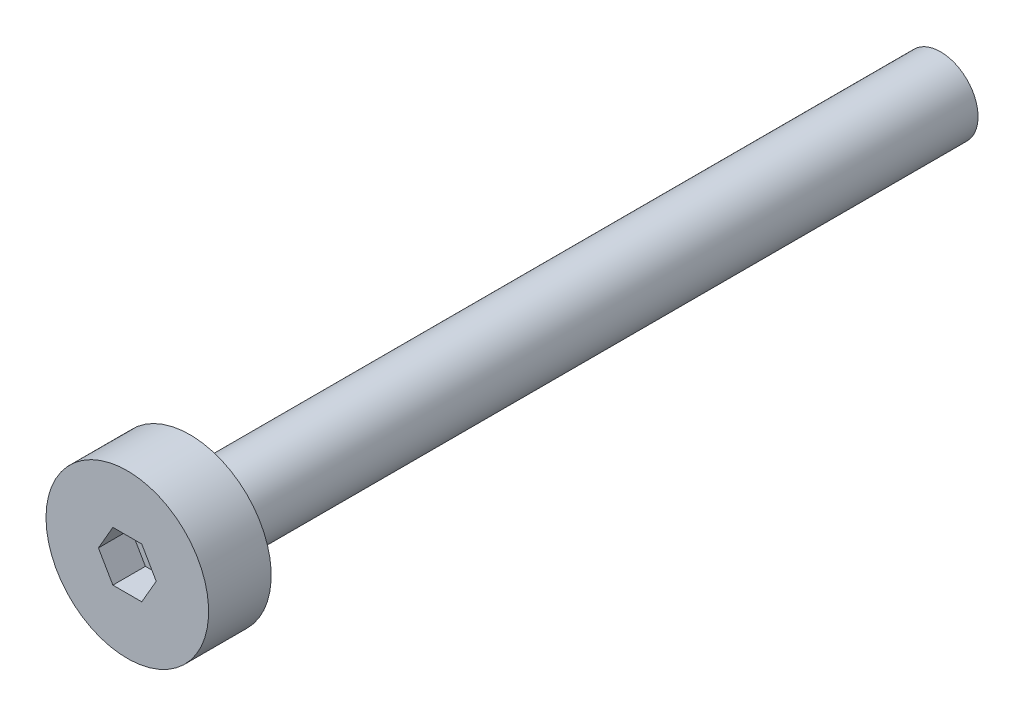
ISO-10303-21;
HEADER;
FILE_DESCRIPTION(('STEP AP214'),'2;1');
FILE_NAME('part.step','',(''),(''),'','','');
FILE_SCHEMA(('AUTOMOTIVE_DESIGN { 1 0 10303 214 1 1 1 1 }'));
ENDSEC;
DATA;
#1=APPLICATION_CONTEXT('core data for automotive mechanical design processes');
#2=APPLICATION_PROTOCOL_DEFINITION('international standard','automotive_design',2000,#1);
#3=PRODUCT_CONTEXT('',#1,'mechanical');
#4=PRODUCT('Part','Part','',(#3));
#5=PRODUCT_RELATED_PRODUCT_CATEGORY('part','',(#4));
#6=PRODUCT_DEFINITION_FORMATION('','',#4);
#7=PRODUCT_DEFINITION_CONTEXT('part definition',#1,'design');
#8=PRODUCT_DEFINITION('design','',#6,#7);
#9=PRODUCT_DEFINITION_SHAPE('','',#8);
#10=(LENGTH_UNIT() NAMED_UNIT(*) SI_UNIT(.MILLI.,.METRE.));
#11=(NAMED_UNIT(*) PLANE_ANGLE_UNIT() SI_UNIT($,.RADIAN.));
#12=(NAMED_UNIT(*) SI_UNIT($,.STERADIAN.) SOLID_ANGLE_UNIT());
#13=UNCERTAINTY_MEASURE_WITH_UNIT(LENGTH_MEASURE(1.E-05),#10,'distance_accuracy_value','');
#14=(GEOMETRIC_REPRESENTATION_CONTEXT(3) GLOBAL_UNCERTAINTY_ASSIGNED_CONTEXT((#13)) GLOBAL_UNIT_ASSIGNED_CONTEXT((#10,
#11,#12)) REPRESENTATION_CONTEXT('',''));
#15=CARTESIAN_POINT('',(0.,0.,0.));
#16=DIRECTION('',(0.,0.,1.));
#17=DIRECTION('',(1.,0.,0.));
#18=AXIS2_PLACEMENT_3D('',#15,#16,#17);
#19=CARTESIAN_POINT('',(0.,0.,1.2));
#20=DIRECTION('',(0.,0.,1.));
#21=DIRECTION('',(1.,0.,0.));
#22=AXIS2_PLACEMENT_3D('',#19,#20,#21);
#23=PLANE('',#22);
#24=DIRECTION('',(-0.50000000000019,0.866025403784329,0.));
#25=VECTOR('',#24,1.);
#26=CARTESIAN_POINT('',(1.154700538379,0.,1.2));
#27=LINE('',#26,#25);
#28=CARTESIAN_POINT('',(1.154700538379,0.,1.2));
#29=VERTEX_POINT('',#28);
#30=CARTESIAN_POINT('',(0.57735026919,1.,1.2));
#31=VERTEX_POINT('',#30);
#32=EDGE_CURVE('E9',#29,#31,#27,.T.);
#33=ORIENTED_EDGE('',*,*,#32,.T.);
#34=DIRECTION('',(-1.,0.,0.));
#35=VECTOR('',#34,1.);
#36=CARTESIAN_POINT('',(0.57735026919,1.,1.2));
#37=LINE('',#36,#35);
#38=CARTESIAN_POINT('',(-0.57735026919,1.,1.2));
#39=VERTEX_POINT('',#38);
#40=EDGE_CURVE('E151',#31,#39,#37,.T.);
#41=ORIENTED_EDGE('',*,*,#40,.T.);
#42=DIRECTION('',(-0.50000000000019,-0.866025403784329,0.));
#43=VECTOR('',#42,1.);
#44=CARTESIAN_POINT('',(-0.57735026919,1.,1.2));
#45=LINE('',#44,#43);
#46=CARTESIAN_POINT('',(-1.154700538379,0.,1.2));
#47=VERTEX_POINT('',#46);
#48=EDGE_CURVE('E152',#39,#47,#45,.T.);
#49=ORIENTED_EDGE('',*,*,#48,.T.);
#50=DIRECTION('',(0.50000000000019,-0.866025403784329,0.));
#51=VECTOR('',#50,1.);
#52=CARTESIAN_POINT('',(-1.154700538379,0.,1.2));
#53=LINE('',#52,#51);
#54=CARTESIAN_POINT('',(-0.57735026919,-1.,1.2));
#55=VERTEX_POINT('',#54);
#56=EDGE_CURVE('E141',#47,#55,#53,.T.);
#57=ORIENTED_EDGE('',*,*,#56,.T.);
#58=DIRECTION('',(1.,0.,0.));
#59=VECTOR('',#58,1.);
#60=CARTESIAN_POINT('',(-0.57735026919,-1.,1.2));
#61=LINE('',#60,#59);
#62=CARTESIAN_POINT('',(0.57735026919,-1.,1.2));
#63=VERTEX_POINT('',#62);
#64=EDGE_CURVE('E18',#55,#63,#61,.T.);
#65=ORIENTED_EDGE('',*,*,#64,.T.);
#66=DIRECTION('',(0.50000000000019,0.866025403784329,0.));
#67=VECTOR('',#66,1.);
#68=CARTESIAN_POINT('',(0.57735026919,-1.,1.2));
#69=LINE('',#68,#67);
#70=EDGE_CURVE('E98',#63,#29,#69,.T.);
#71=ORIENTED_EDGE('',*,*,#70,.T.);
#72=EDGE_LOOP('',(#33,#41,#49,#57,#65,#71));
#73=FACE_BOUND('',#72,.T.);
#74=ADVANCED_FACE('F14',(#73),#23,.T.);
#75=CARTESIAN_POINT('',(0.,0.,-30.));
#76=DIRECTION('',(0.,0.,-1.));
#77=DIRECTION('',(0.,-1.,0.));
#78=AXIS2_PLACEMENT_3D('',#75,#76,#77);
#79=PLANE('',#78);
#80=CARTESIAN_POINT('',(0.,0.,-30.));
#81=DIRECTION('',(0.,0.,-1.));
#82=DIRECTION('',(-1.,0.,0.));
#83=AXIS2_PLACEMENT_3D('',#80,#81,#82);
#84=CIRCLE('',#83,1.5);
#85=CARTESIAN_POINT('',(-1.5,0.,-30.));
#86=VERTEX_POINT('',#85);
#87=EDGE_CURVE('E96',#86,#86,#84,.T.);
#88=ORIENTED_EDGE('',*,*,#87,.T.);
#89=EDGE_LOOP('',(#88));
#90=FACE_BOUND('',#89,.T.);
#91=ADVANCED_FACE('F16',(#90),#79,.T.);
#92=CARTESIAN_POINT('',(1.154700538379,0.,1.2));
#93=DIRECTION('',(-0.866025403784329,-0.50000000000019,0.));
#94=DIRECTION('',(-0.50000000000019,0.866025403784329,0.));
#95=AXIS2_PLACEMENT_3D('',#92,#93,#94);
#96=PLANE('',#95);
#97=ORIENTED_EDGE('',*,*,#32,.F.);
#98=DIRECTION('',(0.,0.,1.));
#99=VECTOR('',#98,1.);
#100=CARTESIAN_POINT('',(1.154700538379,0.,1.2));
#101=LINE('',#100,#99);
#102=CARTESIAN_POINT('',(1.154700538379,0.,2.5));
#103=VERTEX_POINT('',#102);
#104=EDGE_CURVE('E123',#29,#103,#101,.T.);
#105=ORIENTED_EDGE('',*,*,#104,.T.);
#106=DIRECTION('',(-0.50000000000019,0.866025403784329,0.));
#107=VECTOR('',#106,1.);
#108=CARTESIAN_POINT('',(1.010362971082,0.25,2.5));
#109=LINE('',#108,#107);
#110=CARTESIAN_POINT('',(0.57735026919,1.,2.5));
#111=VERTEX_POINT('',#110);
#112=EDGE_CURVE('E116',#103,#111,#109,.T.);
#113=ORIENTED_EDGE('',*,*,#112,.T.);
#114=DIRECTION('',(0.,0.,1.));
#115=VECTOR('',#114,1.);
#116=CARTESIAN_POINT('',(0.57735026919,1.,1.2));
#117=LINE('',#116,#115);
#118=EDGE_CURVE('E25',#31,#111,#117,.T.);
#119=ORIENTED_EDGE('',*,*,#118,.F.);
#120=EDGE_LOOP('',(#97,#105,#113,#119));
#121=FACE_BOUND('',#120,.T.);
#122=ADVANCED_FACE('F176',(#121),#96,.T.);
#123=CARTESIAN_POINT('',(0.57735026919,1.,1.2));
#124=DIRECTION('',(0.,-1.,0.));
#125=DIRECTION('',(-1.,0.,0.));
#126=AXIS2_PLACEMENT_3D('',#123,#124,#125);
#127=PLANE('',#126);
#128=ORIENTED_EDGE('',*,*,#40,.F.);
#129=ORIENTED_EDGE('',*,*,#118,.T.);
#130=DIRECTION('',(-1.,0.,0.));
#131=VECTOR('',#130,1.);
#132=CARTESIAN_POINT('',(0.288675134595,1.,2.5));
#133=LINE('',#132,#131);
#134=CARTESIAN_POINT('',(-0.57735026919,1.,2.5));
#135=VERTEX_POINT('',#134);
#136=EDGE_CURVE('E119',#111,#135,#133,.T.);
#137=ORIENTED_EDGE('',*,*,#136,.T.);
#138=DIRECTION('',(0.,0.,1.));
#139=VECTOR('',#138,1.);
#140=CARTESIAN_POINT('',(-0.57735026919,1.,1.2));
#141=LINE('',#140,#139);
#142=EDGE_CURVE('E148',#39,#135,#141,.T.);
#143=ORIENTED_EDGE('',*,*,#142,.F.);
#144=EDGE_LOOP('',(#128,#129,#137,#143));
#145=FACE_BOUND('',#144,.T.);
#146=ADVANCED_FACE('F170',(#145),#127,.T.);
#147=CARTESIAN_POINT('',(-0.57735026919,1.,1.2));
#148=DIRECTION('',(0.866025403784329,-0.50000000000019,0.));
#149=DIRECTION('',(0.,0.,-1.));
#150=AXIS2_PLACEMENT_3D('',#147,#148,#149);
#151=PLANE('',#150);
#152=ORIENTED_EDGE('',*,*,#48,.F.);
#153=ORIENTED_EDGE('',*,*,#142,.T.);
#154=DIRECTION('',(-0.50000000000019,-0.866025403784329,0.));
#155=VECTOR('',#154,1.);
#156=CARTESIAN_POINT('',(-0.721687836487,0.75,2.5));
#157=LINE('',#156,#155);
#158=CARTESIAN_POINT('',(-1.154700538379,0.,2.5));
#159=VERTEX_POINT('',#158);
#160=EDGE_CURVE('E111',#135,#159,#157,.T.);
#161=ORIENTED_EDGE('',*,*,#160,.T.);
#162=DIRECTION('',(0.,0.,1.));
#163=VECTOR('',#162,1.);
#164=CARTESIAN_POINT('',(-1.154700538379,0.,1.2));
#165=LINE('',#164,#163);
#166=EDGE_CURVE('E147',#47,#159,#165,.T.);
#167=ORIENTED_EDGE('',*,*,#166,.F.);
#168=EDGE_LOOP('',(#152,#153,#161,#167));
#169=FACE_BOUND('',#168,.T.);
#170=ADVANCED_FACE('F192',(#169),#151,.T.);
#171=CARTESIAN_POINT('',(-1.154700538379,0.,1.2));
#172=DIRECTION('',(0.866025403784329,0.50000000000019,0.));
#173=DIRECTION('',(0.,0.,-1.));
#174=AXIS2_PLACEMENT_3D('',#171,#172,#173);
#175=PLANE('',#174);
#176=ORIENTED_EDGE('',*,*,#56,.F.);
#177=ORIENTED_EDGE('',*,*,#166,.T.);
#178=DIRECTION('',(0.50000000000019,-0.866025403784329,0.));
#179=VECTOR('',#178,1.);
#180=CARTESIAN_POINT('',(-1.010362971082,-0.25,2.5));
#181=LINE('',#180,#179);
#182=CARTESIAN_POINT('',(-0.57735026919,-1.,2.5));
#183=VERTEX_POINT('',#182);
#184=EDGE_CURVE('E133',#159,#183,#181,.T.);
#185=ORIENTED_EDGE('',*,*,#184,.T.);
#186=DIRECTION('',(0.,0.,1.));
#187=VECTOR('',#186,1.);
#188=CARTESIAN_POINT('',(-0.57735026919,-1.,1.2));
#189=LINE('',#188,#187);
#190=EDGE_CURVE('E82',#55,#183,#189,.T.);
#191=ORIENTED_EDGE('',*,*,#190,.F.);
#192=EDGE_LOOP('',(#176,#177,#185,#191));
#193=FACE_BOUND('',#192,.T.);
#194=ADVANCED_FACE('F207',(#193),#175,.T.);
#195=CARTESIAN_POINT('',(-0.57735026919,-1.,1.2));
#196=DIRECTION('',(0.,1.,0.));
#197=DIRECTION('',(1.,0.,0.));
#198=AXIS2_PLACEMENT_3D('',#195,#196,#197);
#199=PLANE('',#198);
#200=ORIENTED_EDGE('',*,*,#64,.F.);
#201=ORIENTED_EDGE('',*,*,#190,.T.);
#202=DIRECTION('',(1.,0.,0.));
#203=VECTOR('',#202,1.);
#204=CARTESIAN_POINT('',(-0.288675134595,-1.,2.5));
#205=LINE('',#204,#203);
#206=CARTESIAN_POINT('',(0.57735026919,-1.,2.5));
#207=VERTEX_POINT('',#206);
#208=EDGE_CURVE('E130',#183,#207,#205,.T.);
#209=ORIENTED_EDGE('',*,*,#208,.T.);
#210=DIRECTION('',(0.,0.,1.));
#211=VECTOR('',#210,1.);
#212=CARTESIAN_POINT('',(0.57735026919,-1.,1.2));
#213=LINE('',#212,#211);
#214=EDGE_CURVE('E104',#63,#207,#213,.T.);
#215=ORIENTED_EDGE('',*,*,#214,.F.);
#216=EDGE_LOOP('',(#200,#201,#209,#215));
#217=FACE_BOUND('',#216,.T.);
#218=ADVANCED_FACE('F208',(#217),#199,.T.);
#219=CARTESIAN_POINT('',(0.57735026919,-1.,1.2));
#220=DIRECTION('',(-0.866025403784329,0.50000000000019,0.));
#221=DIRECTION('',(0.,0.,1.));
#222=AXIS2_PLACEMENT_3D('',#219,#220,#221);
#223=PLANE('',#222);
#224=ORIENTED_EDGE('',*,*,#70,.F.);
#225=ORIENTED_EDGE('',*,*,#214,.T.);
#226=DIRECTION('',(0.50000000000019,0.866025403784329,0.));
#227=VECTOR('',#226,1.);
#228=CARTESIAN_POINT('',(0.721687836487,-0.75,2.5));
#229=LINE('',#228,#227);
#230=EDGE_CURVE('E107',#207,#103,#229,.T.);
#231=ORIENTED_EDGE('',*,*,#230,.T.);
#232=ORIENTED_EDGE('',*,*,#104,.F.);
#233=EDGE_LOOP('',(#224,#225,#231,#232));
#234=FACE_BOUND('',#233,.T.);
#235=ADVANCED_FACE('F252',(#234),#223,.T.);
#236=CARTESIAN_POINT('',(0.,0.,0.));
#237=DIRECTION('',(0.,0.,-1.));
#238=DIRECTION('',(-1.,0.,0.));
#239=AXIS2_PLACEMENT_3D('',#236,#237,#238);
#240=CYLINDRICAL_SURFACE('',#239,1.5);
#241=ORIENTED_EDGE('',*,*,#87,.F.);
#242=DIRECTION('',(0.,0.,-1.));
#243=VECTOR('',#242,1.);
#244=CARTESIAN_POINT('',(-1.5,0.,0.));
#245=LINE('',#244,#243);
#246=CARTESIAN_POINT('',(-1.5,0.,0.));
#247=VERTEX_POINT('',#246);
#248=EDGE_CURVE('E91',#247,#86,#245,.T.);
#249=ORIENTED_EDGE('',*,*,#248,.F.);
#250=CARTESIAN_POINT('',(0.,0.,0.));
#251=DIRECTION('',(0.,0.,-1.));
#252=DIRECTION('',(-1.,0.,0.));
#253=AXIS2_PLACEMENT_3D('',#250,#251,#252);
#254=CIRCLE('',#253,1.5);
#255=EDGE_CURVE('E94',#247,#247,#254,.T.);
#256=ORIENTED_EDGE('',*,*,#255,.T.);
#257=ORIENTED_EDGE('',*,*,#248,.T.);
#258=EDGE_LOOP('',(#241,#249,#256,#257));
#259=FACE_BOUND('',#258,.T.);
#260=ADVANCED_FACE('F92',(#259),#240,.T.);
#261=CARTESIAN_POINT('',(0.,0.,2.5));
#262=DIRECTION('',(0.,0.,-1.));
#263=DIRECTION('',(0.,-1.,0.));
#264=AXIS2_PLACEMENT_3D('',#261,#262,#263);
#265=PLANE('',#264);
#266=ORIENTED_EDGE('',*,*,#208,.F.);
#267=ORIENTED_EDGE('',*,*,#184,.F.);
#268=ORIENTED_EDGE('',*,*,#160,.F.);
#269=ORIENTED_EDGE('',*,*,#136,.F.);
#270=ORIENTED_EDGE('',*,*,#112,.F.);
#271=ORIENTED_EDGE('',*,*,#230,.F.);
#272=EDGE_LOOP('',(#266,#267,#268,#269,#270,#271));
#273=FACE_BOUND('',#272,.T.);
#274=CARTESIAN_POINT('',(0.,0.,2.5));
#275=DIRECTION('',(0.,0.,-1.));
#276=DIRECTION('',(-1.,0.,0.));
#277=AXIS2_PLACEMENT_3D('',#274,#275,#276);
#278=CIRCLE('',#277,3.25);
#279=CARTESIAN_POINT('',(-3.25,0.,2.5));
#280=VERTEX_POINT('',#279);
#281=EDGE_CURVE('E136',#280,#280,#278,.T.);
#282=ORIENTED_EDGE('',*,*,#281,.F.);
#283=EDGE_LOOP('',(#282));
#284=FACE_BOUND('',#283,.T.);
#285=ADVANCED_FACE('F181',(#273,#284),#265,.F.);
#286=CARTESIAN_POINT('',(0.,0.,0.));
#287=DIRECTION('',(0.,0.,-1.));
#288=DIRECTION('',(0.,-1.,0.));
#289=AXIS2_PLACEMENT_3D('',#286,#287,#288);
#290=PLANE('',#289);
#291=ORIENTED_EDGE('',*,*,#255,.F.);
#292=EDGE_LOOP('',(#291));
#293=FACE_BOUND('',#292,.T.);
#294=CARTESIAN_POINT('',(0.,0.,0.));
#295=DIRECTION('',(0.,0.,-1.));
#296=DIRECTION('',(-1.,0.,0.));
#297=AXIS2_PLACEMENT_3D('',#294,#295,#296);
#298=CIRCLE('',#297,3.25);
#299=CARTESIAN_POINT('',(-3.25,0.,0.));
#300=VERTEX_POINT('',#299);
#301=EDGE_CURVE('E112',#300,#300,#298,.T.);
#302=ORIENTED_EDGE('',*,*,#301,.T.);
#303=EDGE_LOOP('',(#302));
#304=FACE_BOUND('',#303,.T.);
#305=ADVANCED_FACE('F241',(#293,#304),#290,.T.);
#306=CARTESIAN_POINT('',(0.,0.,2.5));
#307=DIRECTION('',(0.,0.,-1.));
#308=DIRECTION('',(-1.,0.,0.));
#309=AXIS2_PLACEMENT_3D('',#306,#307,#308);
#310=CYLINDRICAL_SURFACE('',#309,3.25);
#311=ORIENTED_EDGE('',*,*,#301,.F.);
#312=DIRECTION('',(0.,0.,-1.));
#313=VECTOR('',#312,1.);
#314=CARTESIAN_POINT('',(-3.25,0.,2.5));
#315=LINE('',#314,#313);
#316=EDGE_CURVE('E115',#280,#300,#315,.T.);
#317=ORIENTED_EDGE('',*,*,#316,.F.);
#318=ORIENTED_EDGE('',*,*,#281,.T.);
#319=ORIENTED_EDGE('',*,*,#316,.T.);
#320=EDGE_LOOP('',(#311,#317,#318,#319));
#321=FACE_BOUND('',#320,.T.);
#322=ADVANCED_FACE('F278',(#321),#310,.T.);
#323=CLOSED_SHELL('',(#74,#91,#122,#146,#170,#194,#218,#235,#260,#285,#305,#322));
#324=MANIFOLD_SOLID_BREP('B1',#323);
#325=ADVANCED_BREP_SHAPE_REPRESENTATION('',(#18,#324),#14);
#326=SHAPE_DEFINITION_REPRESENTATION(#9,#325);
ENDSEC;
END-ISO-10303-21;
